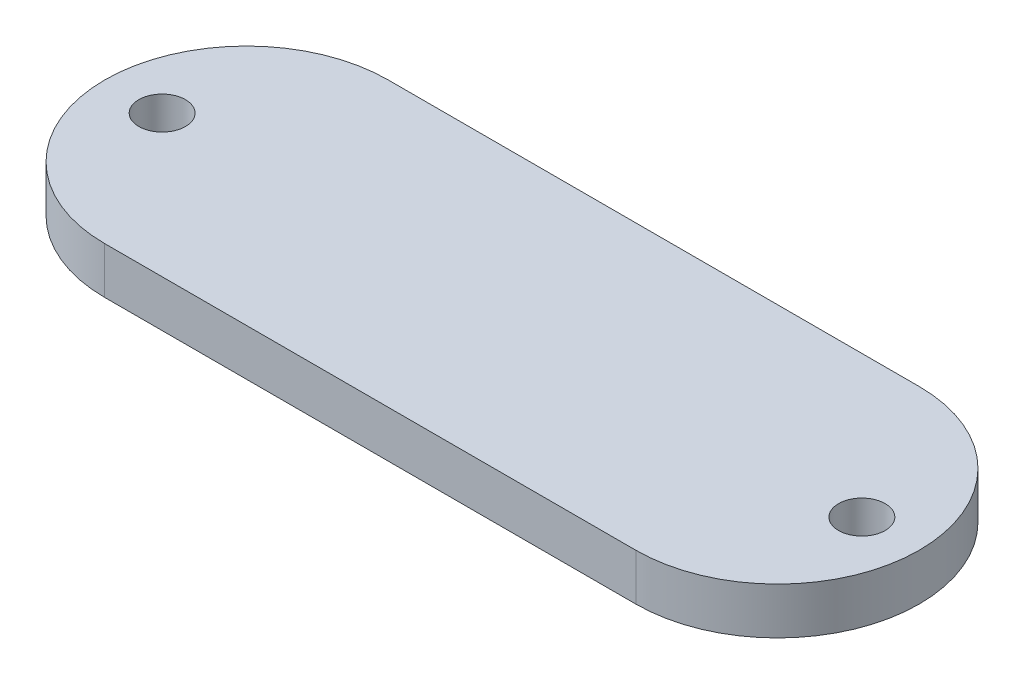
ISO-10303-21;
HEADER;
FILE_DESCRIPTION(('STEP AP214'),'2;1');
FILE_NAME('part.step','',(''),(''),'','','');
FILE_SCHEMA(('AUTOMOTIVE_DESIGN { 1 0 10303 214 1 1 1 1 }'));
ENDSEC;
DATA;
#1=APPLICATION_CONTEXT('core data for automotive mechanical design processes');
#2=APPLICATION_PROTOCOL_DEFINITION('international standard','automotive_design',2000,#1);
#3=PRODUCT_CONTEXT('',#1,'mechanical');
#4=PRODUCT('Part','Part','',(#3));
#5=PRODUCT_RELATED_PRODUCT_CATEGORY('part','',(#4));
#6=PRODUCT_DEFINITION_FORMATION('','',#4);
#7=PRODUCT_DEFINITION_CONTEXT('part definition',#1,'design');
#8=PRODUCT_DEFINITION('design','',#6,#7);
#9=PRODUCT_DEFINITION_SHAPE('','',#8);
#10=(LENGTH_UNIT() NAMED_UNIT(*) SI_UNIT(.MILLI.,.METRE.));
#11=(NAMED_UNIT(*) PLANE_ANGLE_UNIT() SI_UNIT($,.RADIAN.));
#12=(NAMED_UNIT(*) SI_UNIT($,.STERADIAN.) SOLID_ANGLE_UNIT());
#13=UNCERTAINTY_MEASURE_WITH_UNIT(LENGTH_MEASURE(1.E-05),#10,'distance_accuracy_value','');
#14=(GEOMETRIC_REPRESENTATION_CONTEXT(3) GLOBAL_UNCERTAINTY_ASSIGNED_CONTEXT((#13)) GLOBAL_UNIT_ASSIGNED_CONTEXT((#10,
#11,#12)) REPRESENTATION_CONTEXT('',''));
#15=CARTESIAN_POINT('',(0.,0.,0.));
#16=DIRECTION('',(0.,0.,1.));
#17=DIRECTION('',(1.,0.,0.));
#18=AXIS2_PLACEMENT_3D('',#15,#16,#17);
#19=CARTESIAN_POINT('',(-37.,6.5,0.));
#20=DIRECTION('',(0.,1.,0.));
#21=DIRECTION('',(0.,0.,1.));
#22=AXIS2_PLACEMENT_3D('',#19,#20,#21);
#23=PLANE('',#22);
#24=CARTESIAN_POINT('',(-48.75,6.5,0.));
#25=DIRECTION('',(0.,1.,0.));
#26=DIRECTION('',(0.,0.,1.));
#27=AXIS2_PLACEMENT_3D('',#24,#25,#26);
#28=CIRCLE('',#27,3.25);
#29=CARTESIAN_POINT('',(-48.75,6.5,-3.24999999999999));
#30=VERTEX_POINT('',#29);
#31=EDGE_CURVE('E111',#30,#30,#28,.T.);
#32=ORIENTED_EDGE('',*,*,#31,.F.);
#33=EDGE_LOOP('',(#32));
#34=FACE_BOUND('',#33,.T.);
#35=DIRECTION('',(-1.,0.,0.));
#36=VECTOR('',#35,1.);
#37=CARTESIAN_POINT('',(0.,6.5,-19.75));
#38=LINE('',#37,#36);
#39=CARTESIAN_POINT('',(37.,6.5,-19.75));
#40=VERTEX_POINT('',#39);
#41=CARTESIAN_POINT('',(-37.,6.5,-19.75));
#42=VERTEX_POINT('',#41);
#43=EDGE_CURVE('E57',#40,#42,#38,.T.);
#44=ORIENTED_EDGE('',*,*,#43,.T.);
#45=CARTESIAN_POINT('',(-37.,6.5,0.));
#46=DIRECTION('',(0.,1.,0.));
#47=DIRECTION('',(0.,0.,1.));
#48=AXIS2_PLACEMENT_3D('',#45,#46,#47);
#49=CIRCLE('',#48,19.75);
#50=CARTESIAN_POINT('',(-37.,6.5,19.75));
#51=VERTEX_POINT('',#50);
#52=EDGE_CURVE('E87',#42,#51,#49,.T.);
#53=ORIENTED_EDGE('',*,*,#52,.T.);
#54=DIRECTION('',(1.,0.,0.));
#55=VECTOR('',#54,1.);
#56=CARTESIAN_POINT('',(0.,6.5,19.75));
#57=LINE('',#56,#55);
#58=CARTESIAN_POINT('',(37.,6.5,19.75));
#59=VERTEX_POINT('',#58);
#60=EDGE_CURVE('E91',#51,#59,#57,.T.);
#61=ORIENTED_EDGE('',*,*,#60,.T.);
#62=CARTESIAN_POINT('',(37.,6.5,0.));
#63=DIRECTION('',(0.,1.,0.));
#64=DIRECTION('',(0.,0.,1.));
#65=AXIS2_PLACEMENT_3D('',#62,#63,#64);
#66=CIRCLE('',#65,19.75);
#67=EDGE_CURVE('E102',#59,#40,#66,.T.);
#68=ORIENTED_EDGE('',*,*,#67,.T.);
#69=EDGE_LOOP('',(#44,#53,#61,#68));
#70=FACE_BOUND('',#69,.T.);
#71=CARTESIAN_POINT('',(48.75,6.5,0.));
#72=DIRECTION('',(0.,1.,0.));
#73=DIRECTION('',(0.,0.,1.));
#74=AXIS2_PLACEMENT_3D('',#71,#72,#73);
#75=CIRCLE('',#74,3.25);
#76=CARTESIAN_POINT('',(48.75,6.5,-3.25));
#77=VERTEX_POINT('',#76);
#78=EDGE_CURVE('E155',#77,#77,#75,.T.);
#79=ORIENTED_EDGE('',*,*,#78,.F.);
#80=EDGE_LOOP('',(#79));
#81=FACE_BOUND('',#80,.T.);
#82=ADVANCED_FACE('F39',(#34,#70,#81),#23,.T.);
#83=CARTESIAN_POINT('',(-37.,0.,0.));
#84=DIRECTION('',(0.,1.,0.));
#85=DIRECTION('',(0.,0.,1.));
#86=AXIS2_PLACEMENT_3D('',#83,#84,#85);
#87=PLANE('',#86);
#88=CARTESIAN_POINT('',(-37.,0.,0.));
#89=DIRECTION('',(0.,1.,0.));
#90=DIRECTION('',(0.,0.,1.));
#91=AXIS2_PLACEMENT_3D('',#88,#89,#90);
#92=CIRCLE('',#91,19.75);
#93=CARTESIAN_POINT('',(-37.,0.,-19.75));
#94=VERTEX_POINT('',#93);
#95=CARTESIAN_POINT('',(-37.,0.,19.75));
#96=VERTEX_POINT('',#95);
#97=EDGE_CURVE('E96',#94,#96,#92,.T.);
#98=ORIENTED_EDGE('',*,*,#97,.F.);
#99=DIRECTION('',(-1.,0.,0.));
#100=VECTOR('',#99,1.);
#101=CARTESIAN_POINT('',(0.,0.,-19.75));
#102=LINE('',#101,#100);
#103=CARTESIAN_POINT('',(37.,0.,-19.75));
#104=VERTEX_POINT('',#103);
#105=EDGE_CURVE('E116',#104,#94,#102,.T.);
#106=ORIENTED_EDGE('',*,*,#105,.F.);
#107=CARTESIAN_POINT('',(37.,0.,0.));
#108=DIRECTION('',(0.,1.,0.));
#109=DIRECTION('',(0.,0.,1.));
#110=AXIS2_PLACEMENT_3D('',#107,#108,#109);
#111=CIRCLE('',#110,19.75);
#112=CARTESIAN_POINT('',(37.,0.,19.75));
#113=VERTEX_POINT('',#112);
#114=EDGE_CURVE('E81',#113,#104,#111,.T.);
#115=ORIENTED_EDGE('',*,*,#114,.F.);
#116=DIRECTION('',(1.,0.,0.));
#117=VECTOR('',#116,1.);
#118=CARTESIAN_POINT('',(0.,0.,19.75));
#119=LINE('',#118,#117);
#120=EDGE_CURVE('E74',#96,#113,#119,.T.);
#121=ORIENTED_EDGE('',*,*,#120,.F.);
#122=EDGE_LOOP('',(#98,#106,#115,#121));
#123=FACE_BOUND('',#122,.T.);
#124=CARTESIAN_POINT('',(-48.75,0.,0.));
#125=DIRECTION('',(0.,1.,0.));
#126=DIRECTION('',(0.,0.,1.));
#127=AXIS2_PLACEMENT_3D('',#124,#125,#126);
#128=CIRCLE('',#127,3.25);
#129=CARTESIAN_POINT('',(-48.75,0.,-3.24999999999999));
#130=VERTEX_POINT('',#129);
#131=EDGE_CURVE('E163',#130,#130,#128,.T.);
#132=ORIENTED_EDGE('',*,*,#131,.T.);
#133=EDGE_LOOP('',(#132));
#134=FACE_BOUND('',#133,.T.);
#135=CARTESIAN_POINT('',(48.75,0.,0.));
#136=DIRECTION('',(0.,1.,0.));
#137=DIRECTION('',(0.,0.,1.));
#138=AXIS2_PLACEMENT_3D('',#135,#136,#137);
#139=CIRCLE('',#138,3.25);
#140=CARTESIAN_POINT('',(48.75,0.,-3.25));
#141=VERTEX_POINT('',#140);
#142=EDGE_CURVE('E158',#141,#141,#139,.T.);
#143=ORIENTED_EDGE('',*,*,#142,.T.);
#144=EDGE_LOOP('',(#143));
#145=FACE_BOUND('',#144,.T.);
#146=ADVANCED_FACE('F125',(#123,#134,#145),#87,.F.);
#147=CARTESIAN_POINT('',(-37.,6.5,0.));
#148=DIRECTION('',(0.,-1.,0.));
#149=DIRECTION('',(0.,0.,-1.));
#150=AXIS2_PLACEMENT_3D('',#147,#148,#149);
#151=CYLINDRICAL_SURFACE('',#150,19.75);
#152=ORIENTED_EDGE('',*,*,#97,.T.);
#153=DIRECTION('',(0.,-1.,0.));
#154=VECTOR('',#153,1.);
#155=CARTESIAN_POINT('',(-37.,6.5,19.75));
#156=LINE('',#155,#154);
#157=EDGE_CURVE('E49',#51,#96,#156,.T.);
#158=ORIENTED_EDGE('',*,*,#157,.F.);
#159=ORIENTED_EDGE('',*,*,#52,.F.);
#160=DIRECTION('',(0.,-1.,0.));
#161=VECTOR('',#160,1.);
#162=CARTESIAN_POINT('',(-37.,6.5,-19.75));
#163=LINE('',#162,#161);
#164=EDGE_CURVE('E11',#42,#94,#163,.T.);
#165=ORIENTED_EDGE('',*,*,#164,.T.);
#166=EDGE_LOOP('',(#152,#158,#159,#165));
#167=FACE_BOUND('',#166,.T.);
#168=ADVANCED_FACE('F41',(#167),#151,.T.);
#169=CARTESIAN_POINT('',(0.,6.5,19.75));
#170=DIRECTION('',(0.,0.,-1.));
#171=DIRECTION('',(-1.,0.,0.));
#172=AXIS2_PLACEMENT_3D('',#169,#170,#171);
#173=PLANE('',#172);
#174=ORIENTED_EDGE('',*,*,#120,.T.);
#175=DIRECTION('',(0.,-1.,0.));
#176=VECTOR('',#175,1.);
#177=CARTESIAN_POINT('',(37.,6.5,19.75));
#178=LINE('',#177,#176);
#179=EDGE_CURVE('E98',#59,#113,#178,.T.);
#180=ORIENTED_EDGE('',*,*,#179,.F.);
#181=ORIENTED_EDGE('',*,*,#60,.F.);
#182=ORIENTED_EDGE('',*,*,#157,.T.);
#183=EDGE_LOOP('',(#174,#180,#181,#182));
#184=FACE_BOUND('',#183,.T.);
#185=ADVANCED_FACE('F99',(#184),#173,.F.);
#186=CARTESIAN_POINT('',(37.,6.5,0.));
#187=DIRECTION('',(0.,-1.,0.));
#188=DIRECTION('',(0.,0.,-1.));
#189=AXIS2_PLACEMENT_3D('',#186,#187,#188);
#190=CYLINDRICAL_SURFACE('',#189,19.75);
#191=ORIENTED_EDGE('',*,*,#114,.T.);
#192=DIRECTION('',(0.,-1.,0.));
#193=VECTOR('',#192,1.);
#194=CARTESIAN_POINT('',(37.,6.5,-19.75));
#195=LINE('',#194,#193);
#196=EDGE_CURVE('E105',#40,#104,#195,.T.);
#197=ORIENTED_EDGE('',*,*,#196,.F.);
#198=ORIENTED_EDGE('',*,*,#67,.F.);
#199=ORIENTED_EDGE('',*,*,#179,.T.);
#200=EDGE_LOOP('',(#191,#197,#198,#199));
#201=FACE_BOUND('',#200,.T.);
#202=ADVANCED_FACE('F122',(#201),#190,.T.);
#203=CARTESIAN_POINT('',(0.,6.5,-19.75));
#204=DIRECTION('',(0.,0.,1.));
#205=DIRECTION('',(1.,0.,0.));
#206=AXIS2_PLACEMENT_3D('',#203,#204,#205);
#207=PLANE('',#206);
#208=ORIENTED_EDGE('',*,*,#105,.T.);
#209=ORIENTED_EDGE('',*,*,#164,.F.);
#210=ORIENTED_EDGE('',*,*,#43,.F.);
#211=ORIENTED_EDGE('',*,*,#196,.T.);
#212=EDGE_LOOP('',(#208,#209,#210,#211));
#213=FACE_BOUND('',#212,.T.);
#214=ADVANCED_FACE('F127',(#213),#207,.F.);
#215=CARTESIAN_POINT('',(-48.75,6.5,0.));
#216=DIRECTION('',(0.,-1.,0.));
#217=DIRECTION('',(0.,0.,-1.));
#218=AXIS2_PLACEMENT_3D('',#215,#216,#217);
#219=CYLINDRICAL_SURFACE('',#218,3.25);
#220=CARTESIAN_POINT('',(-48.75,6.5,-3.24999999999999));
#221=CARTESIAN_POINT('',(-48.75,6.43229166666667,-3.24999999999999));
#222=CARTESIAN_POINT('',(-48.75,6.36458333333333,-3.24999999999999));
#223=CARTESIAN_POINT('',(-48.75,6.22916666666667,-3.24999999999999));
#224=CARTESIAN_POINT('',(-48.75,6.16145833333333,-3.24999999999999));
#225=CARTESIAN_POINT('',(-48.75,6.02604166666667,-3.24999999999999));
#226=CARTESIAN_POINT('',(-48.75,5.95833333333333,-3.24999999999999));
#227=CARTESIAN_POINT('',(-48.75,5.82291666666667,-3.24999999999999));
#228=CARTESIAN_POINT('',(-48.75,5.75520833333333,-3.24999999999999));
#229=CARTESIAN_POINT('',(-48.75,5.61979166666667,-3.24999999999999));
#230=CARTESIAN_POINT('',(-48.75,5.55208333333333,-3.24999999999999));
#231=CARTESIAN_POINT('',(-48.75,5.41666666666667,-3.24999999999999));
#232=CARTESIAN_POINT('',(-48.75,5.34895833333333,-3.24999999999999));
#233=CARTESIAN_POINT('',(-48.75,5.21354166666667,-3.24999999999999));
#234=CARTESIAN_POINT('',(-48.75,5.14583333333333,-3.24999999999999));
#235=CARTESIAN_POINT('',(-48.75,5.01041666666667,-3.24999999999999));
#236=CARTESIAN_POINT('',(-48.75,4.94270833333333,-3.24999999999999));
#237=CARTESIAN_POINT('',(-48.75,4.80729166666667,-3.24999999999999));
#238=CARTESIAN_POINT('',(-48.75,4.73958333333333,-3.24999999999999));
#239=CARTESIAN_POINT('',(-48.75,4.60416666666667,-3.24999999999999));
#240=CARTESIAN_POINT('',(-48.75,4.53645833333333,-3.24999999999999));
#241=CARTESIAN_POINT('',(-48.75,4.40104166666667,-3.24999999999999));
#242=CARTESIAN_POINT('',(-48.75,4.33333333333333,-3.24999999999999));
#243=CARTESIAN_POINT('',(-48.75,4.19791666666667,-3.24999999999999));
#244=CARTESIAN_POINT('',(-48.75,4.13020833333333,-3.24999999999999));
#245=CARTESIAN_POINT('',(-48.75,3.99479166666667,-3.24999999999999));
#246=CARTESIAN_POINT('',(-48.75,3.92708333333333,-3.24999999999999));
#247=CARTESIAN_POINT('',(-48.75,3.79166666666667,-3.24999999999999));
#248=CARTESIAN_POINT('',(-48.75,3.72395833333333,-3.24999999999999));
#249=CARTESIAN_POINT('',(-48.75,3.58854166666667,-3.24999999999999));
#250=CARTESIAN_POINT('',(-48.75,3.52083333333333,-3.24999999999999));
#251=CARTESIAN_POINT('',(-48.75,3.38541666666667,-3.24999999999999));
#252=CARTESIAN_POINT('',(-48.75,3.31770833333333,-3.24999999999999));
#253=CARTESIAN_POINT('',(-48.75,3.18229166666667,-3.24999999999999));
#254=CARTESIAN_POINT('',(-48.75,3.11458333333333,-3.24999999999999));
#255=CARTESIAN_POINT('',(-48.75,2.97916666666667,-3.24999999999999));
#256=CARTESIAN_POINT('',(-48.75,2.91145833333333,-3.24999999999999));
#257=CARTESIAN_POINT('',(-48.75,2.77604166666667,-3.24999999999999));
#258=CARTESIAN_POINT('',(-48.75,2.70833333333333,-3.24999999999999));
#259=CARTESIAN_POINT('',(-48.75,2.57291666666667,-3.24999999999999));
#260=CARTESIAN_POINT('',(-48.75,2.50520833333333,-3.24999999999999));
#261=CARTESIAN_POINT('',(-48.75,2.36979166666667,-3.24999999999999));
#262=CARTESIAN_POINT('',(-48.75,2.30208333333333,-3.24999999999999));
#263=CARTESIAN_POINT('',(-48.75,2.16666666666667,-3.24999999999999));
#264=CARTESIAN_POINT('',(-48.75,2.09895833333333,-3.24999999999999));
#265=CARTESIAN_POINT('',(-48.75,1.96354166666667,-3.24999999999999));
#266=CARTESIAN_POINT('',(-48.75,1.89583333333333,-3.24999999999999));
#267=CARTESIAN_POINT('',(-48.75,1.76041666666667,-3.24999999999999));
#268=CARTESIAN_POINT('',(-48.75,1.69270833333333,-3.24999999999999));
#269=CARTESIAN_POINT('',(-48.75,1.55729166666667,-3.24999999999999));
#270=CARTESIAN_POINT('',(-48.75,1.48958333333333,-3.24999999999999));
#271=CARTESIAN_POINT('',(-48.75,1.35416666666667,-3.24999999999999));
#272=CARTESIAN_POINT('',(-48.75,1.28645833333333,-3.24999999999999));
#273=CARTESIAN_POINT('',(-48.75,1.15104166666667,-3.24999999999999));
#274=CARTESIAN_POINT('',(-48.75,1.08333333333333,-3.24999999999999));
#275=CARTESIAN_POINT('',(-48.75,0.947916666666667,-3.24999999999999));
#276=CARTESIAN_POINT('',(-48.75,0.880208333333333,-3.24999999999999));
#277=CARTESIAN_POINT('',(-48.75,0.744791666666667,-3.24999999999999));
#278=CARTESIAN_POINT('',(-48.75,0.677083333333333,-3.24999999999999));
#279=CARTESIAN_POINT('',(-48.75,0.541666666666667,-3.24999999999999));
#280=CARTESIAN_POINT('',(-48.75,0.473958333333333,-3.24999999999999));
#281=CARTESIAN_POINT('',(-48.75,0.338541666666667,-3.24999999999999));
#282=CARTESIAN_POINT('',(-48.75,0.270833333333334,-3.24999999999999));
#283=CARTESIAN_POINT('',(-48.75,0.135416666666667,-3.24999999999999));
#284=CARTESIAN_POINT('',(-48.75,0.0677083333333334,-3.24999999999999));
#285=CARTESIAN_POINT('',(-48.75,0.,-3.24999999999999));
#286=B_SPLINE_CURVE_WITH_KNOTS('',3,(#220,#221,#222,#223,#224,#225,#226,#227,#228,#229,#230,
#231,#232,#233,#234,#235,#236,#237,#238,#239,#240,#241,#242,#243,#244,#245,#246,#247,#248,#249,
#250,#251,#252,#253,#254,#255,#256,#257,#258,#259,#260,#261,#262,#263,#264,#265,#266,#267,#268,
#269,#270,#271,#272,#273,#274,#275,#276,#277,#278,#279,#280,#281,#282,#283,#284,#285),
.UNSPECIFIED.,.F.,.F.,(4,2,2,2,2,2,2,2,2,2,2,2,2,2,2,2,2,2,2,2,2,2,2,2,2,2,2,2,2,2,2,2,4),(0.,
0.203124999999999,0.40625,0.609375,0.812499999999999,1.015625,1.21875,1.421875,1.625,1.828125,
2.03125,2.234375,2.4375,2.640625,2.84375,3.046875,3.25,3.453125,3.65625,3.859375,4.0625,
4.265625,4.46875,4.671875,4.875,5.078125,5.28125,5.484375,5.6875,5.890625,6.09375,6.296875,6.5),.UNSPECIFIED.);
#287=EDGE_CURVE('BSEAM129',#30,#130,#286,.T.);
#288=ORIENTED_EDGE('',*,*,#31,.T.);
#289=ORIENTED_EDGE('',*,*,#131,.F.);
#290=ORIENTED_EDGE('',*,*,#287,.T.);
#291=ORIENTED_EDGE('',*,*,#287,.F.);
#292=EDGE_LOOP('',(#288,#290,#289,#291));
#293=FACE_BOUND('',#292,.T.);
#294=ADVANCED_FACE('F129',(#293),#219,.F.);
#295=CARTESIAN_POINT('',(48.75,6.5,0.));
#296=DIRECTION('',(0.,-1.,0.));
#297=DIRECTION('',(0.,0.,-1.));
#298=AXIS2_PLACEMENT_3D('',#295,#296,#297);
#299=CYLINDRICAL_SURFACE('',#298,3.25);
#300=CARTESIAN_POINT('',(48.75,6.5,-3.25));
#301=CARTESIAN_POINT('',(48.75,6.43229166666667,-3.25));
#302=CARTESIAN_POINT('',(48.75,6.36458333333333,-3.25));
#303=CARTESIAN_POINT('',(48.75,6.22916666666667,-3.25));
#304=CARTESIAN_POINT('',(48.75,6.16145833333333,-3.25));
#305=CARTESIAN_POINT('',(48.75,6.02604166666667,-3.25));
#306=CARTESIAN_POINT('',(48.75,5.95833333333333,-3.25));
#307=CARTESIAN_POINT('',(48.75,5.82291666666667,-3.25));
#308=CARTESIAN_POINT('',(48.75,5.75520833333333,-3.25));
#309=CARTESIAN_POINT('',(48.75,5.61979166666667,-3.25));
#310=CARTESIAN_POINT('',(48.75,5.55208333333333,-3.25));
#311=CARTESIAN_POINT('',(48.75,5.41666666666667,-3.25));
#312=CARTESIAN_POINT('',(48.75,5.34895833333333,-3.25));
#313=CARTESIAN_POINT('',(48.75,5.21354166666667,-3.25));
#314=CARTESIAN_POINT('',(48.75,5.14583333333333,-3.25));
#315=CARTESIAN_POINT('',(48.75,5.01041666666667,-3.25));
#316=CARTESIAN_POINT('',(48.75,4.94270833333333,-3.25));
#317=CARTESIAN_POINT('',(48.75,4.80729166666667,-3.25));
#318=CARTESIAN_POINT('',(48.75,4.73958333333333,-3.25));
#319=CARTESIAN_POINT('',(48.75,4.60416666666667,-3.25));
#320=CARTESIAN_POINT('',(48.75,4.53645833333333,-3.25));
#321=CARTESIAN_POINT('',(48.75,4.40104166666667,-3.25));
#322=CARTESIAN_POINT('',(48.75,4.33333333333333,-3.25));
#323=CARTESIAN_POINT('',(48.75,4.19791666666667,-3.25));
#324=CARTESIAN_POINT('',(48.75,4.13020833333333,-3.25));
#325=CARTESIAN_POINT('',(48.75,3.99479166666667,-3.25));
#326=CARTESIAN_POINT('',(48.75,3.92708333333333,-3.25));
#327=CARTESIAN_POINT('',(48.75,3.79166666666667,-3.25));
#328=CARTESIAN_POINT('',(48.75,3.72395833333333,-3.25));
#329=CARTESIAN_POINT('',(48.75,3.58854166666667,-3.25));
#330=CARTESIAN_POINT('',(48.75,3.52083333333333,-3.25));
#331=CARTESIAN_POINT('',(48.75,3.38541666666667,-3.25));
#332=CARTESIAN_POINT('',(48.75,3.31770833333333,-3.25));
#333=CARTESIAN_POINT('',(48.75,3.18229166666667,-3.25));
#334=CARTESIAN_POINT('',(48.75,3.11458333333333,-3.25));
#335=CARTESIAN_POINT('',(48.75,2.97916666666667,-3.25));
#336=CARTESIAN_POINT('',(48.75,2.91145833333333,-3.25));
#337=CARTESIAN_POINT('',(48.75,2.77604166666667,-3.25));
#338=CARTESIAN_POINT('',(48.75,2.70833333333333,-3.25));
#339=CARTESIAN_POINT('',(48.75,2.57291666666667,-3.25));
#340=CARTESIAN_POINT('',(48.75,2.50520833333333,-3.25));
#341=CARTESIAN_POINT('',(48.75,2.36979166666667,-3.25));
#342=CARTESIAN_POINT('',(48.75,2.30208333333333,-3.25));
#343=CARTESIAN_POINT('',(48.75,2.16666666666667,-3.25));
#344=CARTESIAN_POINT('',(48.75,2.09895833333333,-3.25));
#345=CARTESIAN_POINT('',(48.75,1.96354166666667,-3.25));
#346=CARTESIAN_POINT('',(48.75,1.89583333333333,-3.25));
#347=CARTESIAN_POINT('',(48.75,1.76041666666667,-3.25));
#348=CARTESIAN_POINT('',(48.75,1.69270833333333,-3.25));
#349=CARTESIAN_POINT('',(48.75,1.55729166666667,-3.25));
#350=CARTESIAN_POINT('',(48.75,1.48958333333333,-3.25));
#351=CARTESIAN_POINT('',(48.75,1.35416666666667,-3.25));
#352=CARTESIAN_POINT('',(48.75,1.28645833333333,-3.25));
#353=CARTESIAN_POINT('',(48.75,1.15104166666667,-3.25));
#354=CARTESIAN_POINT('',(48.75,1.08333333333333,-3.25));
#355=CARTESIAN_POINT('',(48.75,0.947916666666667,-3.25));
#356=CARTESIAN_POINT('',(48.75,0.880208333333333,-3.25));
#357=CARTESIAN_POINT('',(48.75,0.744791666666667,-3.25));
#358=CARTESIAN_POINT('',(48.75,0.677083333333333,-3.25));
#359=CARTESIAN_POINT('',(48.75,0.541666666666667,-3.25));
#360=CARTESIAN_POINT('',(48.75,0.473958333333333,-3.25));
#361=CARTESIAN_POINT('',(48.75,0.338541666666667,-3.25));
#362=CARTESIAN_POINT('',(48.75,0.270833333333334,-3.25));
#363=CARTESIAN_POINT('',(48.75,0.135416666666667,-3.25));
#364=CARTESIAN_POINT('',(48.75,0.0677083333333334,-3.25));
#365=CARTESIAN_POINT('',(48.75,0.,-3.25));
#366=B_SPLINE_CURVE_WITH_KNOTS('',3,(#300,#301,#302,#303,#304,#305,#306,#307,#308,#309,#310,
#311,#312,#313,#314,#315,#316,#317,#318,#319,#320,#321,#322,#323,#324,#325,#326,#327,#328,#329,
#330,#331,#332,#333,#334,#335,#336,#337,#338,#339,#340,#341,#342,#343,#344,#345,#346,#347,#348,
#349,#350,#351,#352,#353,#354,#355,#356,#357,#358,#359,#360,#361,#362,#363,#364,#365),
.UNSPECIFIED.,.F.,.F.,(4,2,2,2,2,2,2,2,2,2,2,2,2,2,2,2,2,2,2,2,2,2,2,2,2,2,2,2,2,2,2,2,4),(0.,
0.203124999999999,0.40625,0.609375,0.812499999999999,1.015625,1.21875,1.421875,1.625,1.828125,
2.03125,2.234375,2.4375,2.640625,2.84375,3.046875,3.25,3.453125,3.65625,3.859375,4.0625,
4.265625,4.46875,4.671875,4.875,5.078125,5.28125,5.484375,5.6875,5.890625,6.09375,6.296875,6.5),.UNSPECIFIED.);
#367=EDGE_CURVE('BSEAM135',#77,#141,#366,.T.);
#368=ORIENTED_EDGE('',*,*,#78,.T.);
#369=ORIENTED_EDGE('',*,*,#142,.F.);
#370=ORIENTED_EDGE('',*,*,#367,.T.);
#371=ORIENTED_EDGE('',*,*,#367,.F.);
#372=EDGE_LOOP('',(#368,#370,#369,#371));
#373=FACE_BOUND('',#372,.T.);
#374=ADVANCED_FACE('F135',(#373),#299,.F.);
#375=CLOSED_SHELL('',(#82,#146,#168,#185,#202,#214,#294,#374));
#376=MANIFOLD_SOLID_BREP('B2',#375);
#377=ADVANCED_BREP_SHAPE_REPRESENTATION('',(#18,#376),#14);
#378=SHAPE_DEFINITION_REPRESENTATION(#9,#377);
ENDSEC;
END-ISO-10303-21;
